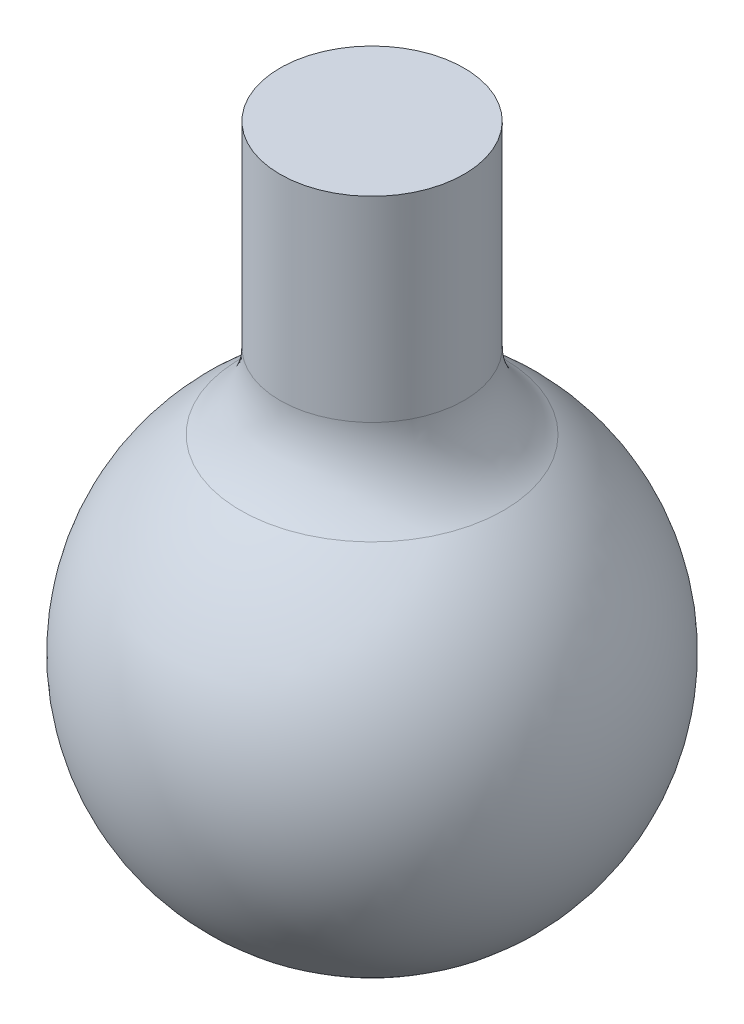
ISO-10303-21;
HEADER;
FILE_DESCRIPTION(('STEP AP214'),'2;1');
FILE_NAME('part.step','',(''),(''),'','','');
FILE_SCHEMA(('AUTOMOTIVE_DESIGN { 1 0 10303 214 1 1 1 1 }'));
ENDSEC;
DATA;
#1=APPLICATION_CONTEXT('core data for automotive mechanical design processes');
#2=APPLICATION_PROTOCOL_DEFINITION('international standard','automotive_design',2000,#1);
#3=PRODUCT_CONTEXT('',#1,'mechanical');
#4=PRODUCT('Part','Part','',(#3));
#5=PRODUCT_RELATED_PRODUCT_CATEGORY('part','',(#4));
#6=PRODUCT_DEFINITION_FORMATION('','',#4);
#7=PRODUCT_DEFINITION_CONTEXT('part definition',#1,'design');
#8=PRODUCT_DEFINITION('design','',#6,#7);
#9=PRODUCT_DEFINITION_SHAPE('','',#8);
#10=(LENGTH_UNIT() NAMED_UNIT(*) SI_UNIT(.MILLI.,.METRE.));
#11=(NAMED_UNIT(*) PLANE_ANGLE_UNIT() SI_UNIT($,.RADIAN.));
#12=(NAMED_UNIT(*) SI_UNIT($,.STERADIAN.) SOLID_ANGLE_UNIT());
#13=UNCERTAINTY_MEASURE_WITH_UNIT(LENGTH_MEASURE(1.E-05),#10,'distance_accuracy_value','');
#14=(GEOMETRIC_REPRESENTATION_CONTEXT(3) GLOBAL_UNCERTAINTY_ASSIGNED_CONTEXT((#13)) GLOBAL_UNIT_ASSIGNED_CONTEXT((#10,
#11,#12)) REPRESENTATION_CONTEXT('',''));
#15=CARTESIAN_POINT('',(0.,0.,0.));
#16=DIRECTION('',(0.,0.,1.));
#17=DIRECTION('',(1.,0.,0.));
#18=AXIS2_PLACEMENT_3D('',#15,#16,#17);
#19=CARTESIAN_POINT('',(0.,0.,0.));
#20=DIRECTION('',(0.,1.,0.));
#21=DIRECTION('',(1.,0.,0.));
#22=AXIS2_PLACEMENT_3D('',#19,#20,#21);
#23=SPHERICAL_SURFACE('',#22,5.);
#24=CARTESIAN_POINT('',(0.,4.10325903324145,0.));
#25=DIRECTION('',(0.,-1.,0.));
#26=DIRECTION('',(0.,0.,-1.));
#27=AXIS2_PLACEMENT_3D('',#24,#25,#26);
#28=CIRCLE('',#27,2.85714285714286);
#29=CARTESIAN_POINT('',(0.,4.10325903324145,-2.85714285714286));
#30=VERTEX_POINT('',#29);
#31=EDGE_CURVE('E10',#30,#30,#28,.T.);
#32=ORIENTED_EDGE('',*,*,#31,.T.);
#33=EDGE_LOOP('',(#32));
#34=FACE_BOUND('',#33,.T.);
#35=ADVANCED_FACE('F30',(#34),#23,.T.);
#36=CARTESIAN_POINT('',(0.,-5.001,0.));
#37=DIRECTION('',(0.,1.,0.));
#38=DIRECTION('',(0.,0.,1.));
#39=AXIS2_PLACEMENT_3D('',#36,#37,#38);
#40=CYLINDRICAL_SURFACE('',#39,2.);
#41=CARTESIAN_POINT('',(0.,5.74456264653803,0.));
#42=DIRECTION('',(0.,-1.,0.));
#43=DIRECTION('',(0.,0.,-1.));
#44=AXIS2_PLACEMENT_3D('',#41,#42,#43);
#45=CIRCLE('',#44,2.);
#46=CARTESIAN_POINT('',(0.,5.74456264653803,-2.));
#47=VERTEX_POINT('',#46);
#48=EDGE_CURVE('E37',#47,#47,#45,.F.);
#49=ORIENTED_EDGE('',*,*,#48,.T.);
#50=EDGE_LOOP('',(#49));
#51=FACE_BOUND('',#50,.T.);
#52=CARTESIAN_POINT('',(0.,10.,0.));
#53=DIRECTION('',(0.,1.,0.));
#54=DIRECTION('',(0.,0.,1.));
#55=AXIS2_PLACEMENT_3D('',#52,#53,#54);
#56=CIRCLE('',#55,2.);
#57=CARTESIAN_POINT('',(0.,10.,2.));
#58=VERTEX_POINT('',#57);
#59=EDGE_CURVE('E41',#58,#58,#56,.T.);
#60=ORIENTED_EDGE('',*,*,#59,.F.);
#61=EDGE_LOOP('',(#60));
#62=FACE_BOUND('',#61,.T.);
#63=ADVANCED_FACE('F50',(#51,#62),#40,.T.);
#64=CARTESIAN_POINT('',(0.,10.,0.));
#65=DIRECTION('',(0.,1.,0.));
#66=DIRECTION('',(0.,0.,1.));
#67=AXIS2_PLACEMENT_3D('',#64,#65,#66);
#68=PLANE('',#67);
#69=ORIENTED_EDGE('',*,*,#59,.T.);
#70=EDGE_LOOP('',(#69));
#71=FACE_BOUND('',#70,.T.);
#72=ADVANCED_FACE('F48',(#71),#68,.T.);
#73=CARTESIAN_POINT('',(0.,5.74456264653803,0.));
#74=DIRECTION('',(0.,-1.,0.));
#75=DIRECTION('',(0.,0.,-1.));
#76=AXIS2_PLACEMENT_3D('',#73,#74,#75);
#77=TOROIDAL_SURFACE('',#76,4.,2.);
#78=ORIENTED_EDGE('',*,*,#31,.F.);
#79=EDGE_LOOP('',(#78));
#80=FACE_BOUND('',#79,.T.);
#81=ORIENTED_EDGE('',*,*,#48,.F.);
#82=EDGE_LOOP('',(#81));
#83=FACE_BOUND('',#82,.T.);
#84=ADVANCED_FACE('F32',(#80,#83),#77,.F.);
#85=CLOSED_SHELL('',(#35,#63,#72,#84));
#86=MANIFOLD_SOLID_BREP('B2',#85);
#87=ADVANCED_BREP_SHAPE_REPRESENTATION('',(#18,#86),#14);
#88=SHAPE_DEFINITION_REPRESENTATION(#9,#87);
ENDSEC;
END-ISO-10303-21;
